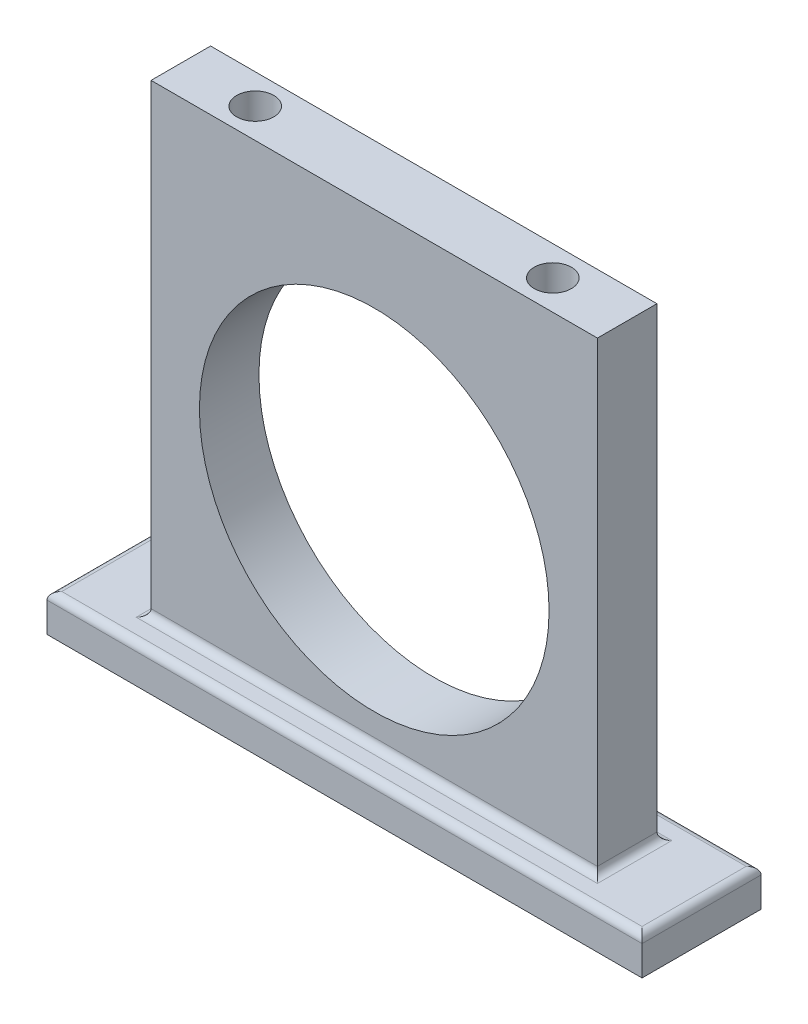
ISO-10303-21;
HEADER;
FILE_DESCRIPTION(('STEP AP214'),'2;1');
FILE_NAME('part.step','',(''),(''),'','','');
FILE_SCHEMA(('AUTOMOTIVE_DESIGN { 1 0 10303 214 1 1 1 1 }'));
ENDSEC;
DATA;
#1=APPLICATION_CONTEXT('core data for automotive mechanical design processes');
#2=APPLICATION_PROTOCOL_DEFINITION('international standard','automotive_design',2000,#1);
#3=PRODUCT_CONTEXT('',#1,'mechanical');
#4=PRODUCT('Part','Part','',(#3));
#5=PRODUCT_RELATED_PRODUCT_CATEGORY('part','',(#4));
#6=PRODUCT_DEFINITION_FORMATION('','',#4);
#7=PRODUCT_DEFINITION_CONTEXT('part definition',#1,'design');
#8=PRODUCT_DEFINITION('design','',#6,#7);
#9=PRODUCT_DEFINITION_SHAPE('','',#8);
#10=(LENGTH_UNIT() NAMED_UNIT(*) SI_UNIT(.MILLI.,.METRE.));
#11=(NAMED_UNIT(*) PLANE_ANGLE_UNIT() SI_UNIT($,.RADIAN.));
#12=(NAMED_UNIT(*) SI_UNIT($,.STERADIAN.) SOLID_ANGLE_UNIT());
#13=UNCERTAINTY_MEASURE_WITH_UNIT(LENGTH_MEASURE(1.E-05),#10,'distance_accuracy_value','');
#14=(GEOMETRIC_REPRESENTATION_CONTEXT(3) GLOBAL_UNCERTAINTY_ASSIGNED_CONTEXT((#13)) GLOBAL_UNIT_ASSIGNED_CONTEXT((#10,
#11,#12)) REPRESENTATION_CONTEXT('',''));
#15=CARTESIAN_POINT('',(0.,0.,0.));
#16=DIRECTION('',(0.,0.,1.));
#17=DIRECTION('',(1.,0.,0.));
#18=AXIS2_PLACEMENT_3D('',#15,#16,#17);
#19=CARTESIAN_POINT('',(30.,35.,8.));
#20=DIRECTION('',(-1.,0.,0.));
#21=DIRECTION('',(0.,-1.,0.));
#22=AXIS2_PLACEMENT_3D('',#19,#20,#21);
#23=PLANE('',#22);
#24=DIRECTION('',(0.,1.,0.));
#25=VECTOR('',#24,1.);
#26=CARTESIAN_POINT('',(30.,35.,8.));
#27=LINE('',#26,#25);
#28=CARTESIAN_POINT('',(30.,-26.5,8.));
#29=VERTEX_POINT('',#28);
#30=CARTESIAN_POINT('',(30.,35.,8.));
#31=VERTEX_POINT('',#30);
#32=EDGE_CURVE('E191',#29,#31,#27,.T.);
#33=ORIENTED_EDGE('',*,*,#32,.F.);
#34=DIRECTION('',(0.,0.,1.));
#35=VECTOR('',#34,1.);
#36=CARTESIAN_POINT('',(30.,-26.5,7.99999999999999));
#37=LINE('',#36,#35);
#38=CARTESIAN_POINT('',(30.,-26.5,0.));
#39=VERTEX_POINT('',#38);
#40=EDGE_CURVE('E49',#29,#39,#37,.F.);
#41=ORIENTED_EDGE('',*,*,#40,.T.);
#42=DIRECTION('',(0.,1.,0.));
#43=VECTOR('',#42,1.);
#44=CARTESIAN_POINT('',(30.,35.,0.));
#45=LINE('',#44,#43);
#46=CARTESIAN_POINT('',(30.,35.,0.));
#47=VERTEX_POINT('',#46);
#48=EDGE_CURVE('E189',#39,#47,#45,.T.);
#49=ORIENTED_EDGE('',*,*,#48,.T.);
#50=DIRECTION('',(0.,0.,-1.));
#51=VECTOR('',#50,1.);
#52=CARTESIAN_POINT('',(30.,35.,8.));
#53=LINE('',#52,#51);
#54=EDGE_CURVE('E193',#31,#47,#53,.T.);
#55=ORIENTED_EDGE('',*,*,#54,.F.);
#56=EDGE_LOOP('',(#33,#41,#49,#55));
#57=FACE_BOUND('',#56,.T.);
#58=ADVANCED_FACE('F40',(#57),#23,.F.);
#59=CARTESIAN_POINT('',(0.,0.,8.));
#60=DIRECTION('',(0.,0.,-1.));
#61=DIRECTION('',(-1.,0.,0.));
#62=AXIS2_PLACEMENT_3D('',#59,#60,#61);
#63=PLANE('',#62);
#64=DIRECTION('',(0.,-1.,0.));
#65=VECTOR('',#64,1.);
#66=CARTESIAN_POINT('',(-30.,0.,8.));
#67=LINE('',#66,#65);
#68=CARTESIAN_POINT('',(-30.,35.,8.));
#69=VERTEX_POINT('',#68);
#70=CARTESIAN_POINT('',(-30.,-26.5,8.));
#71=VERTEX_POINT('',#70);
#72=EDGE_CURVE('E188',#69,#71,#67,.T.);
#73=ORIENTED_EDGE('',*,*,#72,.T.);
#74=DIRECTION('',(1.,0.,0.));
#75=VECTOR('',#74,1.);
#76=CARTESIAN_POINT('',(0.,-26.5,8.));
#77=LINE('',#76,#75);
#78=EDGE_CURVE('E64',#71,#29,#77,.T.);
#79=ORIENTED_EDGE('',*,*,#78,.T.);
#80=ORIENTED_EDGE('',*,*,#32,.T.);
#81=DIRECTION('',(-1.,0.,0.));
#82=VECTOR('',#81,1.);
#83=CARTESIAN_POINT('',(-30.,35.,8.));
#84=LINE('',#83,#82);
#85=EDGE_CURVE('E185',#31,#69,#84,.T.);
#86=ORIENTED_EDGE('',*,*,#85,.T.);
#87=EDGE_LOOP('',(#73,#79,#80,#86));
#88=FACE_BOUND('',#87,.T.);
#89=CARTESIAN_POINT('',(0.,0.,8.));
#90=DIRECTION('',(0.,0.,1.));
#91=DIRECTION('',(1.,0.,0.));
#92=AXIS2_PLACEMENT_3D('',#89,#90,#91);
#93=CIRCLE('',#92,23.5);
#94=CARTESIAN_POINT('',(23.5,0.,8.));
#95=VERTEX_POINT('',#94);
#96=EDGE_CURVE('E179',#95,#95,#93,.T.);
#97=ORIENTED_EDGE('',*,*,#96,.F.);
#98=EDGE_LOOP('',(#97));
#99=FACE_BOUND('',#98,.T.);
#100=ADVANCED_FACE('F272',(#88,#99),#63,.F.);
#101=CARTESIAN_POINT('',(0.,0.,0.));
#102=DIRECTION('',(0.,0.,-1.));
#103=DIRECTION('',(-1.,0.,0.));
#104=AXIS2_PLACEMENT_3D('',#101,#102,#103);
#105=PLANE('',#104);
#106=ORIENTED_EDGE('',*,*,#48,.F.);
#107=DIRECTION('',(1.,0.,0.));
#108=VECTOR('',#107,1.);
#109=CARTESIAN_POINT('',(-30.,-26.5,0.));
#110=LINE('',#109,#108);
#111=CARTESIAN_POINT('',(-30.,-26.5,0.));
#112=VERTEX_POINT('',#111);
#113=EDGE_CURVE('E11',#39,#112,#110,.F.);
#114=ORIENTED_EDGE('',*,*,#113,.T.);
#115=DIRECTION('',(0.,-1.,0.));
#116=VECTOR('',#115,1.);
#117=CARTESIAN_POINT('',(-30.,0.,0.));
#118=LINE('',#117,#116);
#119=CARTESIAN_POINT('',(-30.,35.,0.));
#120=VERTEX_POINT('',#119);
#121=EDGE_CURVE('E196',#120,#112,#118,.T.);
#122=ORIENTED_EDGE('',*,*,#121,.F.);
#123=DIRECTION('',(-1.,0.,0.));
#124=VECTOR('',#123,1.);
#125=CARTESIAN_POINT('',(-30.,35.,0.));
#126=LINE('',#125,#124);
#127=EDGE_CURVE('E182',#47,#120,#126,.T.);
#128=ORIENTED_EDGE('',*,*,#127,.F.);
#129=EDGE_LOOP('',(#106,#114,#122,#128));
#130=FACE_BOUND('',#129,.T.);
#131=CARTESIAN_POINT('',(0.,0.,0.));
#132=DIRECTION('',(0.,0.,1.));
#133=DIRECTION('',(1.,0.,0.));
#134=AXIS2_PLACEMENT_3D('',#131,#132,#133);
#135=CIRCLE('',#134,23.5);
#136=CARTESIAN_POINT('',(23.5,0.,0.));
#137=VERTEX_POINT('',#136);
#138=EDGE_CURVE('E176',#137,#137,#135,.T.);
#139=ORIENTED_EDGE('',*,*,#138,.T.);
#140=EDGE_LOOP('',(#139));
#141=FACE_BOUND('',#140,.T.);
#142=ADVANCED_FACE('F281',(#130,#141),#105,.T.);
#143=CARTESIAN_POINT('',(-30.,35.,8.));
#144=DIRECTION('',(0.,-1.,0.));
#145=DIRECTION('',(1.,0.,0.));
#146=AXIS2_PLACEMENT_3D('',#143,#144,#145);
#147=PLANE('',#146);
#148=CARTESIAN_POINT('',(-20.,35.,4.));
#149=DIRECTION('',(0.,1.,0.));
#150=DIRECTION('',(0.,0.,1.));
#151=AXIS2_PLACEMENT_3D('',#148,#149,#150);
#152=CIRCLE('',#151,2.49999999999999);
#153=CARTESIAN_POINT('',(-20.,35.,6.49999999999999));
#154=VERTEX_POINT('',#153);
#155=EDGE_CURVE('E145',#154,#154,#152,.T.);
#156=ORIENTED_EDGE('',*,*,#155,.F.);
#157=EDGE_LOOP('',(#156));
#158=FACE_BOUND('',#157,.T.);
#159=CARTESIAN_POINT('',(20.,35.,4.));
#160=DIRECTION('',(0.,1.,0.));
#161=DIRECTION('',(0.,0.,1.));
#162=AXIS2_PLACEMENT_3D('',#159,#160,#161);
#163=CIRCLE('',#162,2.49999999999999);
#164=CARTESIAN_POINT('',(20.,35.,6.49999999999999));
#165=VERTEX_POINT('',#164);
#166=EDGE_CURVE('E144',#165,#165,#163,.T.);
#167=ORIENTED_EDGE('',*,*,#166,.F.);
#168=EDGE_LOOP('',(#167));
#169=FACE_BOUND('',#168,.T.);
#170=ORIENTED_EDGE('',*,*,#127,.T.);
#171=DIRECTION('',(0.,0.,-1.));
#172=VECTOR('',#171,1.);
#173=CARTESIAN_POINT('',(-30.,35.,8.));
#174=LINE('',#173,#172);
#175=EDGE_CURVE('E202',#69,#120,#174,.T.);
#176=ORIENTED_EDGE('',*,*,#175,.F.);
#177=ORIENTED_EDGE('',*,*,#85,.F.);
#178=ORIENTED_EDGE('',*,*,#54,.T.);
#179=EDGE_LOOP('',(#170,#176,#177,#178));
#180=FACE_BOUND('',#179,.T.);
#181=ADVANCED_FACE('F278',(#158,#169,#180),#147,.F.);
#182=CARTESIAN_POINT('',(-30.,0.,8.));
#183=DIRECTION('',(1.,0.,0.));
#184=DIRECTION('',(0.,1.,0.));
#185=AXIS2_PLACEMENT_3D('',#182,#183,#184);
#186=PLANE('',#185);
#187=ORIENTED_EDGE('',*,*,#121,.T.);
#188=DIRECTION('',(0.,0.,1.));
#189=VECTOR('',#188,1.);
#190=CARTESIAN_POINT('',(-30.,-26.5,7.99999999999999));
#191=LINE('',#190,#189);
#192=EDGE_CURVE('E232',#112,#71,#191,.T.);
#193=ORIENTED_EDGE('',*,*,#192,.T.);
#194=ORIENTED_EDGE('',*,*,#72,.F.);
#195=ORIENTED_EDGE('',*,*,#175,.T.);
#196=EDGE_LOOP('',(#187,#193,#194,#195));
#197=FACE_BOUND('',#196,.T.);
#198=ADVANCED_FACE('F271',(#197),#186,.F.);
#199=CARTESIAN_POINT('',(30.,-32.5,8.));
#200=DIRECTION('',(0.,1.,0.));
#201=DIRECTION('',(-1.,0.,0.));
#202=AXIS2_PLACEMENT_3D('',#199,#200,#201);
#203=PLANE('',#202);
#204=DIRECTION('',(0.,0.,-1.));
#205=VECTOR('',#204,1.);
#206=CARTESIAN_POINT('',(40.,-32.5,12.));
#207=LINE('',#206,#205);
#208=CARTESIAN_POINT('',(40.,-32.5,12.));
#209=VERTEX_POINT('',#208);
#210=CARTESIAN_POINT('',(40.,-32.5,-4.));
#211=VERTEX_POINT('',#210);
#212=EDGE_CURVE('E162',#209,#211,#207,.T.);
#213=ORIENTED_EDGE('',*,*,#212,.F.);
#214=DIRECTION('',(1.,0.,0.));
#215=VECTOR('',#214,1.);
#216=CARTESIAN_POINT('',(-40.,-32.5,12.));
#217=LINE('',#216,#215);
#218=CARTESIAN_POINT('',(-40.,-32.5,12.));
#219=VERTEX_POINT('',#218);
#220=EDGE_CURVE('E173',#219,#209,#217,.T.);
#221=ORIENTED_EDGE('',*,*,#220,.F.);
#222=DIRECTION('',(0.,0.,-1.));
#223=VECTOR('',#222,1.);
#224=CARTESIAN_POINT('',(-40.,-32.5,12.));
#225=LINE('',#224,#223);
#226=CARTESIAN_POINT('',(-40.,-32.5,-4.));
#227=VERTEX_POINT('',#226);
#228=EDGE_CURVE('E167',#219,#227,#225,.T.);
#229=ORIENTED_EDGE('',*,*,#228,.T.);
#230=DIRECTION('',(1.,0.,0.));
#231=VECTOR('',#230,1.);
#232=CARTESIAN_POINT('',(-40.,-32.5,-4.));
#233=LINE('',#232,#231);
#234=EDGE_CURVE('E174',#227,#211,#233,.T.);
#235=ORIENTED_EDGE('',*,*,#234,.T.);
#236=EDGE_LOOP('',(#213,#221,#229,#235));
#237=FACE_BOUND('',#236,.T.);
#238=ADVANCED_FACE('F291',(#237),#203,.F.);
#239=CARTESIAN_POINT('',(0.,0.,8.));
#240=DIRECTION('',(0.,0.,-1.));
#241=DIRECTION('',(-1.,0.,0.));
#242=AXIS2_PLACEMENT_3D('',#239,#240,#241);
#243=CYLINDRICAL_SURFACE('',#242,23.5);
#244=ORIENTED_EDGE('',*,*,#96,.T.);
#245=EDGE_LOOP('',(#244));
#246=FACE_BOUND('',#245,.T.);
#247=ORIENTED_EDGE('',*,*,#138,.F.);
#248=EDGE_LOOP('',(#247));
#249=FACE_BOUND('',#248,.T.);
#250=ADVANCED_FACE('F294',(#246,#249),#243,.F.);
#251=CARTESIAN_POINT('',(-40.,-27.5,12.));
#252=DIRECTION('',(0.,1.,0.));
#253=DIRECTION('',(0.,0.,1.));
#254=AXIS2_PLACEMENT_3D('',#251,#252,#253);
#255=PLANE('',#254);
#256=DIRECTION('',(0.,0.,1.));
#257=VECTOR('',#256,1.);
#258=CARTESIAN_POINT('',(-39.,-27.5,12.));
#259=LINE('',#258,#257);
#260=CARTESIAN_POINT('',(-39.,-27.5,-3.));
#261=VERTEX_POINT('',#260);
#262=CARTESIAN_POINT('',(-39.,-27.5,11.));
#263=VERTEX_POINT('',#262);
#264=EDGE_CURVE('E218',#261,#263,#259,.T.);
#265=ORIENTED_EDGE('',*,*,#264,.T.);
#266=DIRECTION('',(1.,0.,0.));
#267=VECTOR('',#266,1.);
#268=CARTESIAN_POINT('',(-40.,-27.5,11.));
#269=LINE('',#268,#267);
#270=CARTESIAN_POINT('',(39.,-27.5,11.));
#271=VERTEX_POINT('',#270);
#272=EDGE_CURVE('E220',#263,#271,#269,.T.);
#273=ORIENTED_EDGE('',*,*,#272,.T.);
#274=DIRECTION('',(0.,0.,1.));
#275=VECTOR('',#274,1.);
#276=CARTESIAN_POINT('',(39.,-27.5,12.));
#277=LINE('',#276,#275);
#278=CARTESIAN_POINT('',(39.,-27.5,-3.));
#279=VERTEX_POINT('',#278);
#280=EDGE_CURVE('E214',#271,#279,#277,.F.);
#281=ORIENTED_EDGE('',*,*,#280,.T.);
#282=DIRECTION('',(1.,0.,0.));
#283=VECTOR('',#282,1.);
#284=CARTESIAN_POINT('',(-40.,-27.5,-3.));
#285=LINE('',#284,#283);
#286=EDGE_CURVE('E216',#279,#261,#285,.F.);
#287=ORIENTED_EDGE('',*,*,#286,.T.);
#288=EDGE_LOOP('',(#265,#273,#281,#287));
#289=FACE_BOUND('',#288,.T.);
#290=DIRECTION('',(1.,0.,0.));
#291=VECTOR('',#290,1.);
#292=CARTESIAN_POINT('',(-40.,-27.5,9.));
#293=LINE('',#292,#291);
#294=CARTESIAN_POINT('',(31.,-27.5,9.));
#295=VERTEX_POINT('',#294);
#296=CARTESIAN_POINT('',(-31.,-27.5,9.));
#297=VERTEX_POINT('',#296);
#298=EDGE_CURVE('E209',#295,#297,#293,.F.);
#299=ORIENTED_EDGE('',*,*,#298,.T.);
#300=DIRECTION('',(0.,0.,1.));
#301=VECTOR('',#300,1.);
#302=CARTESIAN_POINT('',(-31.,-27.5,12.));
#303=LINE('',#302,#301);
#304=CARTESIAN_POINT('',(-31.,-27.5,-1.));
#305=VERTEX_POINT('',#304);
#306=EDGE_CURVE('E211',#297,#305,#303,.F.);
#307=ORIENTED_EDGE('',*,*,#306,.T.);
#308=DIRECTION('',(1.,0.,0.));
#309=VECTOR('',#308,1.);
#310=CARTESIAN_POINT('',(30.,-27.5,-1.));
#311=LINE('',#310,#309);
#312=CARTESIAN_POINT('',(31.,-27.5,-1.));
#313=VERTEX_POINT('',#312);
#314=EDGE_CURVE('E205',#305,#313,#311,.T.);
#315=ORIENTED_EDGE('',*,*,#314,.T.);
#316=DIRECTION('',(0.,0.,1.));
#317=VECTOR('',#316,1.);
#318=CARTESIAN_POINT('',(31.,-27.5,12.));
#319=LINE('',#318,#317);
#320=EDGE_CURVE('E207',#313,#295,#319,.T.);
#321=ORIENTED_EDGE('',*,*,#320,.T.);
#322=EDGE_LOOP('',(#299,#307,#315,#321));
#323=FACE_BOUND('',#322,.T.);
#324=ADVANCED_FACE('F263',(#289,#323),#255,.T.);
#325=CARTESIAN_POINT('',(-40.,-32.5,12.));
#326=DIRECTION('',(0.,0.,1.));
#327=DIRECTION('',(1.,0.,0.));
#328=AXIS2_PLACEMENT_3D('',#325,#326,#327);
#329=PLANE('',#328);
#330=DIRECTION('',(0.,-1.,0.));
#331=VECTOR('',#330,1.);
#332=CARTESIAN_POINT('',(40.,-32.5,12.));
#333=LINE('',#332,#331);
#334=CARTESIAN_POINT('',(40.,-28.5,12.));
#335=VERTEX_POINT('',#334);
#336=EDGE_CURVE('E156',#335,#209,#333,.T.);
#337=ORIENTED_EDGE('',*,*,#336,.F.);
#338=DIRECTION('',(1.,0.,0.));
#339=VECTOR('',#338,1.);
#340=CARTESIAN_POINT('',(-40.,-28.5,12.));
#341=LINE('',#340,#339);
#342=CARTESIAN_POINT('',(-40.,-28.5,12.));
#343=VERTEX_POINT('',#342);
#344=EDGE_CURVE('E223',#335,#343,#341,.F.);
#345=ORIENTED_EDGE('',*,*,#344,.T.);
#346=DIRECTION('',(0.,-1.,0.));
#347=VECTOR('',#346,1.);
#348=CARTESIAN_POINT('',(-40.,-32.5,12.));
#349=LINE('',#348,#347);
#350=EDGE_CURVE('E165',#343,#219,#349,.T.);
#351=ORIENTED_EDGE('',*,*,#350,.T.);
#352=ORIENTED_EDGE('',*,*,#220,.T.);
#353=EDGE_LOOP('',(#337,#345,#351,#352));
#354=FACE_BOUND('',#353,.T.);
#355=ADVANCED_FACE('F366',(#354),#329,.T.);
#356=CARTESIAN_POINT('',(-40.,-32.5,-4.));
#357=DIRECTION('',(0.,0.,-1.));
#358=DIRECTION('',(-1.,0.,0.));
#359=AXIS2_PLACEMENT_3D('',#356,#357,#358);
#360=PLANE('',#359);
#361=DIRECTION('',(0.,1.,0.));
#362=VECTOR('',#361,1.);
#363=CARTESIAN_POINT('',(-40.,-32.5,-4.));
#364=LINE('',#363,#362);
#365=CARTESIAN_POINT('',(-40.,-28.5,-4.));
#366=VERTEX_POINT('',#365);
#367=EDGE_CURVE('E170',#227,#366,#364,.T.);
#368=ORIENTED_EDGE('',*,*,#367,.T.);
#369=DIRECTION('',(1.,0.,0.));
#370=VECTOR('',#369,1.);
#371=CARTESIAN_POINT('',(-40.,-28.5,-4.));
#372=LINE('',#371,#370);
#373=CARTESIAN_POINT('',(40.,-28.5,-4.));
#374=VERTEX_POINT('',#373);
#375=EDGE_CURVE('E228',#366,#374,#372,.T.);
#376=ORIENTED_EDGE('',*,*,#375,.T.);
#377=DIRECTION('',(0.,1.,0.));
#378=VECTOR('',#377,1.);
#379=CARTESIAN_POINT('',(40.,-32.5,-4.));
#380=LINE('',#379,#378);
#381=EDGE_CURVE('E158',#211,#374,#380,.T.);
#382=ORIENTED_EDGE('',*,*,#381,.F.);
#383=ORIENTED_EDGE('',*,*,#234,.F.);
#384=EDGE_LOOP('',(#368,#376,#382,#383));
#385=FACE_BOUND('',#384,.T.);
#386=ADVANCED_FACE('F358',(#385),#360,.T.);
#387=CARTESIAN_POINT('',(-40.,0.,0.));
#388=DIRECTION('',(-1.,0.,0.));
#389=DIRECTION('',(0.,0.,1.));
#390=AXIS2_PLACEMENT_3D('',#387,#388,#389);
#391=PLANE('',#390);
#392=ORIENTED_EDGE('',*,*,#350,.F.);
#393=DIRECTION('',(0.,0.,1.));
#394=VECTOR('',#393,1.);
#395=CARTESIAN_POINT('',(-40.,-28.5,0.));
#396=LINE('',#395,#394);
#397=EDGE_CURVE('E226',#343,#366,#396,.F.);
#398=ORIENTED_EDGE('',*,*,#397,.T.);
#399=ORIENTED_EDGE('',*,*,#367,.F.);
#400=ORIENTED_EDGE('',*,*,#228,.F.);
#401=EDGE_LOOP('',(#392,#398,#399,#400));
#402=FACE_BOUND('',#401,.T.);
#403=ADVANCED_FACE('F350',(#402),#391,.T.);
#404=CARTESIAN_POINT('',(40.,0.,0.));
#405=DIRECTION('',(1.,0.,0.));
#406=DIRECTION('',(0.,0.,1.));
#407=AXIS2_PLACEMENT_3D('',#404,#405,#406);
#408=PLANE('',#407);
#409=ORIENTED_EDGE('',*,*,#381,.T.);
#410=DIRECTION('',(0.,0.,1.));
#411=VECTOR('',#410,1.);
#412=CARTESIAN_POINT('',(40.,-28.5,0.));
#413=LINE('',#412,#411);
#414=EDGE_CURVE('E230',#374,#335,#413,.T.);
#415=ORIENTED_EDGE('',*,*,#414,.T.);
#416=ORIENTED_EDGE('',*,*,#336,.T.);
#417=ORIENTED_EDGE('',*,*,#212,.T.);
#418=EDGE_LOOP('',(#409,#415,#416,#417));
#419=FACE_BOUND('',#418,.T.);
#420=ADVANCED_FACE('F316',(#419),#408,.T.);
#421=CARTESIAN_POINT('',(-40.,-28.5,-3.));
#422=DIRECTION('',(1.,0.,0.));
#423=DIRECTION('',(0.,1.,0.));
#424=AXIS2_PLACEMENT_3D('',#421,#422,#423);
#425=CYLINDRICAL_SURFACE('',#424,1.);
#426=CARTESIAN_POINT('',(39.,-28.5,-3.));
#427=DIRECTION('',(0.707106781186547,0.,0.707106781186547));
#428=DIRECTION('',(-0.707106781186547,0.,0.707106781186547));
#429=AXIS2_PLACEMENT_3D('',#426,#427,#428);
#430=ELLIPSE('',#429,1.41421356237309,1.);
#431=EDGE_CURVE('E241',#374,#279,#430,.T.);
#432=ORIENTED_EDGE('',*,*,#431,.F.);
#433=ORIENTED_EDGE('',*,*,#375,.F.);
#434=CARTESIAN_POINT('',(-39.,-28.5,-3.));
#435=DIRECTION('',(0.707106781186547,0.,-0.707106781186547));
#436=DIRECTION('',(0.707106781186547,0.,0.707106781186547));
#437=AXIS2_PLACEMENT_3D('',#434,#435,#436);
#438=ELLIPSE('',#437,1.41421356237309,1.);
#439=EDGE_CURVE('E159',#261,#366,#438,.F.);
#440=ORIENTED_EDGE('',*,*,#439,.F.);
#441=ORIENTED_EDGE('',*,*,#286,.F.);
#442=EDGE_LOOP('',(#432,#433,#440,#441));
#443=FACE_BOUND('',#442,.T.);
#444=ADVANCED_FACE('F312',(#443),#425,.T.);
#445=CARTESIAN_POINT('',(-39.,-28.5,12.));
#446=DIRECTION('',(0.,0.,1.));
#447=DIRECTION('',(0.,-1.,0.));
#448=AXIS2_PLACEMENT_3D('',#445,#446,#447);
#449=CYLINDRICAL_SURFACE('',#448,1.);
#450=ORIENTED_EDGE('',*,*,#439,.T.);
#451=ORIENTED_EDGE('',*,*,#397,.F.);
#452=CARTESIAN_POINT('',(-39.,-28.5,11.));
#453=DIRECTION('',(0.707106781186547,0.,0.707106781186547));
#454=DIRECTION('',(-0.707106781186547,0.,0.707106781186547));
#455=AXIS2_PLACEMENT_3D('',#452,#453,#454);
#456=ELLIPSE('',#455,1.41421356237309,1.);
#457=EDGE_CURVE('E239',#263,#343,#456,.T.);
#458=ORIENTED_EDGE('',*,*,#457,.F.);
#459=ORIENTED_EDGE('',*,*,#264,.F.);
#460=EDGE_LOOP('',(#450,#451,#458,#459));
#461=FACE_BOUND('',#460,.T.);
#462=ADVANCED_FACE('F308',(#461),#449,.T.);
#463=CARTESIAN_POINT('',(39.,-28.5,0.));
#464=DIRECTION('',(0.,0.,1.));
#465=DIRECTION('',(0.,-1.,0.));
#466=AXIS2_PLACEMENT_3D('',#463,#464,#465);
#467=CYLINDRICAL_SURFACE('',#466,1.);
#468=ORIENTED_EDGE('',*,*,#431,.T.);
#469=ORIENTED_EDGE('',*,*,#280,.F.);
#470=CARTESIAN_POINT('',(39.,-28.5,11.));
#471=DIRECTION('',(-0.707106781186547,0.,0.707106781186547));
#472=DIRECTION('',(0.707106781186547,0.,0.707106781186547));
#473=AXIS2_PLACEMENT_3D('',#470,#471,#472);
#474=ELLIPSE('',#473,1.41421356237309,1.);
#475=EDGE_CURVE('E237',#335,#271,#474,.T.);
#476=ORIENTED_EDGE('',*,*,#475,.F.);
#477=ORIENTED_EDGE('',*,*,#414,.F.);
#478=EDGE_LOOP('',(#468,#469,#476,#477));
#479=FACE_BOUND('',#478,.T.);
#480=ADVANCED_FACE('F304',(#479),#467,.T.);
#481=CARTESIAN_POINT('',(-40.,-28.5,11.));
#482=DIRECTION('',(1.,0.,0.));
#483=DIRECTION('',(0.,1.,0.));
#484=AXIS2_PLACEMENT_3D('',#481,#482,#483);
#485=CYLINDRICAL_SURFACE('',#484,1.);
#486=ORIENTED_EDGE('',*,*,#457,.T.);
#487=ORIENTED_EDGE('',*,*,#344,.F.);
#488=ORIENTED_EDGE('',*,*,#475,.T.);
#489=ORIENTED_EDGE('',*,*,#272,.F.);
#490=EDGE_LOOP('',(#486,#487,#488,#489));
#491=FACE_BOUND('',#490,.T.);
#492=ADVANCED_FACE('F301',(#491),#485,.T.);
#493=CARTESIAN_POINT('',(31.,-26.5,12.));
#494=DIRECTION('',(0.,0.,1.));
#495=DIRECTION('',(0.,-1.,0.));
#496=AXIS2_PLACEMENT_3D('',#493,#494,#495);
#497=CYLINDRICAL_SURFACE('',#496,1.);
#498=CARTESIAN_POINT('',(31.,-26.5,9.));
#499=DIRECTION('',(-0.707106781186547,0.,0.707106781186547));
#500=DIRECTION('',(0.707106781186547,0.,0.707106781186547));
#501=AXIS2_PLACEMENT_3D('',#498,#499,#500);
#502=ELLIPSE('',#501,1.41421356237309,1.);
#503=EDGE_CURVE('E248',#295,#29,#502,.F.);
#504=ORIENTED_EDGE('',*,*,#503,.F.);
#505=ORIENTED_EDGE('',*,*,#320,.F.);
#506=CARTESIAN_POINT('',(31.,-26.5,-1.));
#507=DIRECTION('',(-0.707106781186547,0.,-0.707106781186547));
#508=DIRECTION('',(-0.707106781186547,0.,0.707106781186547));
#509=AXIS2_PLACEMENT_3D('',#506,#507,#508);
#510=ELLIPSE('',#509,1.41421356237309,1.);
#511=EDGE_CURVE('E44',#39,#313,#510,.F.);
#512=ORIENTED_EDGE('',*,*,#511,.F.);
#513=ORIENTED_EDGE('',*,*,#40,.F.);
#514=EDGE_LOOP('',(#504,#505,#512,#513));
#515=FACE_BOUND('',#514,.T.);
#516=ADVANCED_FACE('F42',(#515),#497,.F.);
#517=CARTESIAN_POINT('',(-40.,-26.5,-1.));
#518=DIRECTION('',(-1.,0.,0.));
#519=DIRECTION('',(0.,-1.,0.));
#520=AXIS2_PLACEMENT_3D('',#517,#518,#519);
#521=CYLINDRICAL_SURFACE('',#520,1.);
#522=ORIENTED_EDGE('',*,*,#511,.T.);
#523=ORIENTED_EDGE('',*,*,#314,.F.);
#524=CARTESIAN_POINT('',(-31.,-26.5,-1.));
#525=DIRECTION('',(-0.707106781186547,0.,0.707106781186547));
#526=DIRECTION('',(-0.707106781186547,0.,-0.707106781186547));
#527=AXIS2_PLACEMENT_3D('',#524,#525,#526);
#528=ELLIPSE('',#527,1.41421356237309,1.);
#529=EDGE_CURVE('E247',#112,#305,#528,.F.);
#530=ORIENTED_EDGE('',*,*,#529,.F.);
#531=ORIENTED_EDGE('',*,*,#113,.F.);
#532=EDGE_LOOP('',(#522,#523,#530,#531));
#533=FACE_BOUND('',#532,.T.);
#534=ADVANCED_FACE('F258',(#533),#521,.F.);
#535=CARTESIAN_POINT('',(0.,-26.5,9.));
#536=DIRECTION('',(1.,0.,0.));
#537=DIRECTION('',(0.,1.,0.));
#538=AXIS2_PLACEMENT_3D('',#535,#536,#537);
#539=CYLINDRICAL_SURFACE('',#538,1.);
#540=ORIENTED_EDGE('',*,*,#503,.T.);
#541=ORIENTED_EDGE('',*,*,#78,.F.);
#542=CARTESIAN_POINT('',(-31.,-26.5,9.));
#543=DIRECTION('',(0.707106781186547,0.,0.707106781186547));
#544=DIRECTION('',(0.707106781186547,0.,-0.707106781186547));
#545=AXIS2_PLACEMENT_3D('',#542,#543,#544);
#546=ELLIPSE('',#545,1.41421356237309,1.);
#547=EDGE_CURVE('E155',#297,#71,#546,.T.);
#548=ORIENTED_EDGE('',*,*,#547,.F.);
#549=ORIENTED_EDGE('',*,*,#298,.F.);
#550=EDGE_LOOP('',(#540,#541,#548,#549));
#551=FACE_BOUND('',#550,.T.);
#552=ADVANCED_FACE('F269',(#551),#539,.F.);
#553=CARTESIAN_POINT('',(-31.,-26.5,7.99999999999999));
#554=DIRECTION('',(0.,0.,1.));
#555=DIRECTION('',(0.,-1.,0.));
#556=AXIS2_PLACEMENT_3D('',#553,#554,#555);
#557=CYLINDRICAL_SURFACE('',#556,1.);
#558=ORIENTED_EDGE('',*,*,#529,.T.);
#559=ORIENTED_EDGE('',*,*,#306,.F.);
#560=ORIENTED_EDGE('',*,*,#547,.T.);
#561=ORIENTED_EDGE('',*,*,#192,.F.);
#562=EDGE_LOOP('',(#558,#559,#560,#561));
#563=FACE_BOUND('',#562,.T.);
#564=ADVANCED_FACE('F267',(#563),#557,.F.);
#565=CARTESIAN_POINT('',(20.,28.,4.));
#566=DIRECTION('',(0.,1.,0.));
#567=DIRECTION('',(0.,0.,1.));
#568=AXIS2_PLACEMENT_3D('',#565,#566,#567);
#569=CONICAL_SURFACE('',#568,2.49999999999999,1.02974425867665);
#570=CARTESIAN_POINT('',(20.,26.4978484524311,4.));
#571=VERTEX_POINT('',#570);
#572=VERTEX_LOOP('',#571);
#573=FACE_BOUND('',#572,.T.);
#574=CARTESIAN_POINT('',(20.,28.,4.));
#575=DIRECTION('',(0.,1.,0.));
#576=DIRECTION('',(0.,0.,1.));
#577=AXIS2_PLACEMENT_3D('',#574,#575,#576);
#578=CIRCLE('',#577,2.49999999999999);
#579=CARTESIAN_POINT('',(20.,28.,6.49999999999999));
#580=VERTEX_POINT('',#579);
#581=EDGE_CURVE('E148',#580,#580,#578,.T.);
#582=ORIENTED_EDGE('',*,*,#581,.T.);
#583=EDGE_LOOP('',(#582));
#584=FACE_BOUND('',#583,.T.);
#585=ADVANCED_FACE('F320',(#573,#584),#569,.F.);
#586=CARTESIAN_POINT('',(20.,35.,4.));
#587=DIRECTION('',(0.,1.,0.));
#588=DIRECTION('',(0.,0.,1.));
#589=AXIS2_PLACEMENT_3D('',#586,#587,#588);
#590=CYLINDRICAL_SURFACE('',#589,2.49999999999999);
#591=ORIENTED_EDGE('',*,*,#581,.F.);
#592=EDGE_LOOP('',(#591));
#593=FACE_BOUND('',#592,.T.);
#594=ORIENTED_EDGE('',*,*,#166,.T.);
#595=EDGE_LOOP('',(#594));
#596=FACE_BOUND('',#595,.T.);
#597=ADVANCED_FACE('F138',(#593,#596),#590,.F.);
#598=CARTESIAN_POINT('',(-20.,28.,4.));
#599=DIRECTION('',(0.,1.,0.));
#600=DIRECTION('',(0.,0.,1.));
#601=AXIS2_PLACEMENT_3D('',#598,#599,#600);
#602=CONICAL_SURFACE('',#601,2.49999999999999,1.02974425867665);
#603=CARTESIAN_POINT('',(-20.,26.4978484524311,4.));
#604=VERTEX_POINT('',#603);
#605=VERTEX_LOOP('',#604);
#606=FACE_BOUND('',#605,.T.);
#607=CARTESIAN_POINT('',(-20.,28.,4.));
#608=DIRECTION('',(0.,1.,0.));
#609=DIRECTION('',(0.,0.,1.));
#610=AXIS2_PLACEMENT_3D('',#607,#608,#609);
#611=CIRCLE('',#610,2.49999999999999);
#612=CARTESIAN_POINT('',(-20.,28.,6.49999999999999));
#613=VERTEX_POINT('',#612);
#614=EDGE_CURVE('E142',#613,#613,#611,.T.);
#615=ORIENTED_EDGE('',*,*,#614,.T.);
#616=EDGE_LOOP('',(#615));
#617=FACE_BOUND('',#616,.T.);
#618=ADVANCED_FACE('F134',(#606,#617),#602,.F.);
#619=CARTESIAN_POINT('',(-20.,35.,4.));
#620=DIRECTION('',(0.,1.,0.));
#621=DIRECTION('',(0.,0.,1.));
#622=AXIS2_PLACEMENT_3D('',#619,#620,#621);
#623=CYLINDRICAL_SURFACE('',#622,2.49999999999999);
#624=ORIENTED_EDGE('',*,*,#614,.F.);
#625=EDGE_LOOP('',(#624));
#626=FACE_BOUND('',#625,.T.);
#627=ORIENTED_EDGE('',*,*,#155,.T.);
#628=EDGE_LOOP('',(#627));
#629=FACE_BOUND('',#628,.T.);
#630=ADVANCED_FACE('F137',(#626,#629),#623,.F.);
#631=CLOSED_SHELL('',(#58,#100,#142,#181,#198,#238,#250,#324,#355,#386,#403,#420,#444,#462,#480,
#492,#516,#534,#552,#564,#585,#597,#618,#630));
#632=MANIFOLD_SOLID_BREP('B2',#631);
#633=ADVANCED_BREP_SHAPE_REPRESENTATION('',(#18,#632),#14);
#634=SHAPE_DEFINITION_REPRESENTATION(#9,#633);
ENDSEC;
END-ISO-10303-21;
